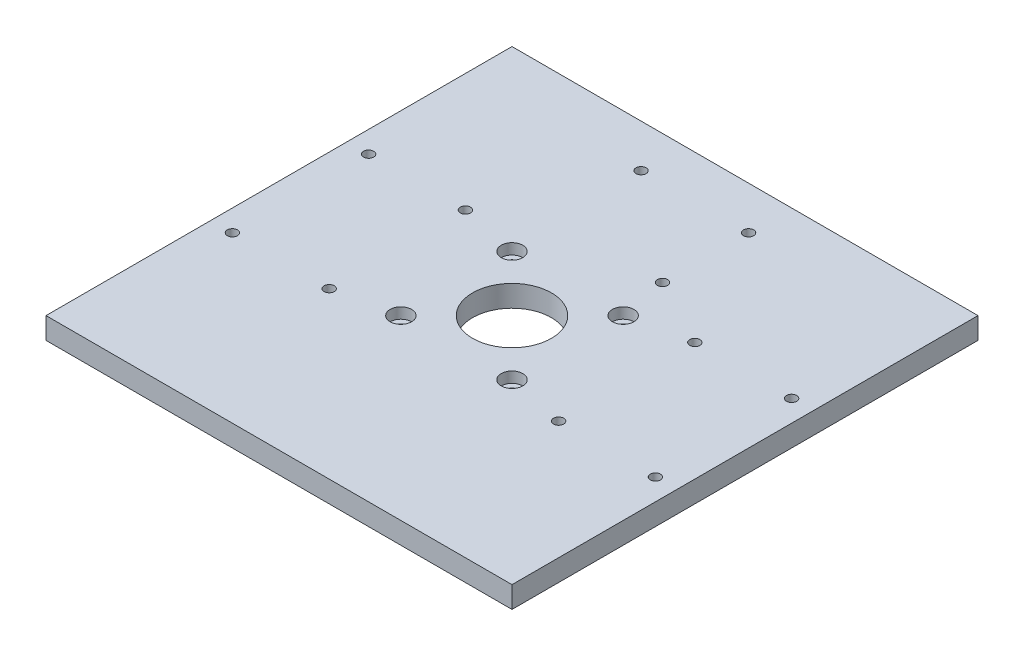
ISO-10303-21;
HEADER;
FILE_DESCRIPTION(('STEP AP214'),'2;1');
FILE_NAME('part.step','',(''),(''),'','','');
FILE_SCHEMA(('AUTOMOTIVE_DESIGN { 1 0 10303 214 1 1 1 1 }'));
ENDSEC;
DATA;
#1=APPLICATION_CONTEXT('core data for automotive mechanical design processes');
#2=APPLICATION_PROTOCOL_DEFINITION('international standard','automotive_design',2000,#1);
#3=PRODUCT_CONTEXT('',#1,'mechanical');
#4=PRODUCT('Part','Part','',(#3));
#5=PRODUCT_RELATED_PRODUCT_CATEGORY('part','',(#4));
#6=PRODUCT_DEFINITION_FORMATION('','',#4);
#7=PRODUCT_DEFINITION_CONTEXT('part definition',#1,'design');
#8=PRODUCT_DEFINITION('design','',#6,#7);
#9=PRODUCT_DEFINITION_SHAPE('','',#8);
#10=(LENGTH_UNIT() NAMED_UNIT(*) SI_UNIT(.MILLI.,.METRE.));
#11=(NAMED_UNIT(*) PLANE_ANGLE_UNIT() SI_UNIT($,.RADIAN.));
#12=(NAMED_UNIT(*) SI_UNIT($,.STERADIAN.) SOLID_ANGLE_UNIT());
#13=UNCERTAINTY_MEASURE_WITH_UNIT(LENGTH_MEASURE(1.E-05),#10,'distance_accuracy_value','');
#14=(GEOMETRIC_REPRESENTATION_CONTEXT(3) GLOBAL_UNCERTAINTY_ASSIGNED_CONTEXT((#13)) GLOBAL_UNIT_ASSIGNED_CONTEXT((#10,
#11,#12)) REPRESENTATION_CONTEXT('',''));
#15=CARTESIAN_POINT('',(0.,0.,0.));
#16=DIRECTION('',(0.,0.,1.));
#17=DIRECTION('',(1.,0.,0.));
#18=AXIS2_PLACEMENT_3D('',#15,#16,#17);
#19=CARTESIAN_POINT('',(-15.4999999999997,0.,15.5));
#20=DIRECTION('',(0.,1.,0.));
#21=DIRECTION('',(0.,0.,1.));
#22=AXIS2_PLACEMENT_3D('',#19,#20,#21);
#23=CYLINDRICAL_SURFACE('',#22,1.42);
#24=CARTESIAN_POINT('',(-15.4999999999997,0.,15.5));
#25=DIRECTION('',(0.,1.,0.));
#26=DIRECTION('',(0.,0.,1.));
#27=AXIS2_PLACEMENT_3D('',#24,#25,#26);
#28=CIRCLE('',#27,1.42);
#29=CARTESIAN_POINT('',(-15.4999999999997,0.,16.92));
#30=VERTEX_POINT('',#29);
#31=EDGE_CURVE('E118',#30,#30,#28,.T.);
#32=ORIENTED_EDGE('',*,*,#31,.F.);
#33=EDGE_LOOP('',(#32));
#34=FACE_BOUND('',#33,.T.);
#35=CARTESIAN_POINT('',(-15.4999999999997,3.,15.5));
#36=DIRECTION('',(0.,1.,0.));
#37=DIRECTION('',(0.,0.,1.));
#38=AXIS2_PLACEMENT_3D('',#35,#36,#37);
#39=CIRCLE('',#38,1.42);
#40=CARTESIAN_POINT('',(-15.4999999999997,3.,16.92));
#41=VERTEX_POINT('',#40);
#42=EDGE_CURVE('E127',#41,#41,#39,.F.);
#43=ORIENTED_EDGE('',*,*,#42,.F.);
#44=EDGE_LOOP('',(#43));
#45=FACE_BOUND('',#44,.T.);
#46=ADVANCED_FACE('F38',(#34,#45),#23,.F.);
#47=CARTESIAN_POINT('',(15.5000000000003,0.,15.5));
#48=DIRECTION('',(0.,1.,0.));
#49=DIRECTION('',(0.,0.,1.));
#50=AXIS2_PLACEMENT_3D('',#47,#48,#49);
#51=CYLINDRICAL_SURFACE('',#50,1.42);
#52=CARTESIAN_POINT('',(15.5000000000003,0.,15.5));
#53=DIRECTION('',(0.,1.,0.));
#54=DIRECTION('',(0.,0.,1.));
#55=AXIS2_PLACEMENT_3D('',#52,#53,#54);
#56=CIRCLE('',#55,1.42);
#57=CARTESIAN_POINT('',(15.5000000000003,0.,16.92));
#58=VERTEX_POINT('',#57);
#59=EDGE_CURVE('E223',#58,#58,#56,.T.);
#60=ORIENTED_EDGE('',*,*,#59,.F.);
#61=EDGE_LOOP('',(#60));
#62=FACE_BOUND('',#61,.T.);
#63=CARTESIAN_POINT('',(15.5000000000003,3.,15.5));
#64=DIRECTION('',(0.,1.,0.));
#65=DIRECTION('',(0.,0.,1.));
#66=AXIS2_PLACEMENT_3D('',#63,#64,#65);
#67=CIRCLE('',#66,1.42);
#68=CARTESIAN_POINT('',(15.5000000000003,3.,16.92));
#69=VERTEX_POINT('',#68);
#70=EDGE_CURVE('E123',#69,#69,#67,.F.);
#71=ORIENTED_EDGE('',*,*,#70,.F.);
#72=EDGE_LOOP('',(#71));
#73=FACE_BOUND('',#72,.T.);
#74=ADVANCED_FACE('F255',(#62,#73),#51,.F.);
#75=CARTESIAN_POINT('',(15.5,0.,-15.5));
#76=DIRECTION('',(0.,1.,0.));
#77=DIRECTION('',(0.,0.,1.));
#78=AXIS2_PLACEMENT_3D('',#75,#76,#77);
#79=CYLINDRICAL_SURFACE('',#78,1.42);
#80=CARTESIAN_POINT('',(15.5,0.,-15.5));
#81=DIRECTION('',(0.,1.,0.));
#82=DIRECTION('',(0.,0.,1.));
#83=AXIS2_PLACEMENT_3D('',#80,#81,#82);
#84=CIRCLE('',#83,1.42);
#85=CARTESIAN_POINT('',(15.5,0.,-14.08));
#86=VERTEX_POINT('',#85);
#87=EDGE_CURVE('E219',#86,#86,#84,.T.);
#88=ORIENTED_EDGE('',*,*,#87,.F.);
#89=EDGE_LOOP('',(#88));
#90=FACE_BOUND('',#89,.T.);
#91=CARTESIAN_POINT('',(15.5,3.,-15.5));
#92=DIRECTION('',(0.,1.,0.));
#93=DIRECTION('',(0.,0.,1.));
#94=AXIS2_PLACEMENT_3D('',#91,#92,#93);
#95=CIRCLE('',#94,1.42);
#96=CARTESIAN_POINT('',(15.5,3.,-14.08));
#97=VERTEX_POINT('',#96);
#98=EDGE_CURVE('E120',#97,#97,#95,.F.);
#99=ORIENTED_EDGE('',*,*,#98,.F.);
#100=EDGE_LOOP('',(#99));
#101=FACE_BOUND('',#100,.T.);
#102=ADVANCED_FACE('F261',(#90,#101),#79,.F.);
#103=CARTESIAN_POINT('',(-15.5,0.,-15.5));
#104=DIRECTION('',(0.,1.,0.));
#105=DIRECTION('',(0.,0.,1.));
#106=AXIS2_PLACEMENT_3D('',#103,#104,#105);
#107=CYLINDRICAL_SURFACE('',#106,1.42);
#108=CARTESIAN_POINT('',(-15.5,0.,-15.5));
#109=DIRECTION('',(0.,1.,0.));
#110=DIRECTION('',(0.,0.,1.));
#111=AXIS2_PLACEMENT_3D('',#108,#109,#110);
#112=CIRCLE('',#111,1.42);
#113=CARTESIAN_POINT('',(-15.5,0.,-14.08));
#114=VERTEX_POINT('',#113);
#115=EDGE_CURVE('E222',#114,#114,#112,.T.);
#116=ORIENTED_EDGE('',*,*,#115,.F.);
#117=EDGE_LOOP('',(#116));
#118=FACE_BOUND('',#117,.T.);
#119=CARTESIAN_POINT('',(-15.5,3.,-15.5));
#120=DIRECTION('',(0.,1.,0.));
#121=DIRECTION('',(0.,0.,1.));
#122=AXIS2_PLACEMENT_3D('',#119,#120,#121);
#123=CIRCLE('',#122,1.42);
#124=CARTESIAN_POINT('',(-15.5,3.,-14.08));
#125=VERTEX_POINT('',#124);
#126=EDGE_CURVE('E115',#125,#125,#123,.F.);
#127=ORIENTED_EDGE('',*,*,#126,.F.);
#128=EDGE_LOOP('',(#127));
#129=FACE_BOUND('',#128,.T.);
#130=ADVANCED_FACE('F267',(#118,#129),#107,.F.);
#131=CARTESIAN_POINT('',(0.,6.,0.));
#132=DIRECTION('',(0.,-1.,0.));
#133=DIRECTION('',(0.,0.,-1.));
#134=AXIS2_PLACEMENT_3D('',#131,#132,#133);
#135=PLANE('',#134);
#136=CARTESIAN_POINT('',(-17.,6.,-53.));
#137=DIRECTION('',(0.,1.,0.));
#138=DIRECTION('',(0.,0.,1.));
#139=AXIS2_PLACEMENT_3D('',#136,#137,#138);
#140=CIRCLE('',#139,1.42);
#141=CARTESIAN_POINT('',(-17.,6.,-51.58));
#142=VERTEX_POINT('',#141);
#143=EDGE_CURVE('E164',#142,#142,#140,.T.);
#144=ORIENTED_EDGE('',*,*,#143,.F.);
#145=EDGE_LOOP('',(#144));
#146=FACE_BOUND('',#145,.T.);
#147=CARTESIAN_POINT('',(13.,6.,-29.));
#148=DIRECTION('',(0.,1.,0.));
#149=DIRECTION('',(0.,0.,1.));
#150=AXIS2_PLACEMENT_3D('',#147,#148,#149);
#151=CIRCLE('',#150,1.42);
#152=CARTESIAN_POINT('',(13.,6.,-27.58));
#153=VERTEX_POINT('',#152);
#154=EDGE_CURVE('E169',#153,#153,#151,.T.);
#155=ORIENTED_EDGE('',*,*,#154,.F.);
#156=EDGE_LOOP('',(#155));
#157=FACE_BOUND('',#156,.T.);
#158=CARTESIAN_POINT('',(13.,6.,-53.));
#159=DIRECTION('',(0.,1.,0.));
#160=DIRECTION('',(0.,0.,1.));
#161=AXIS2_PLACEMENT_3D('',#158,#159,#160);
#162=CIRCLE('',#161,1.42);
#163=CARTESIAN_POINT('',(13.,6.,-51.58));
#164=VERTEX_POINT('',#163);
#165=EDGE_CURVE('E161',#164,#164,#162,.T.);
#166=ORIENTED_EDGE('',*,*,#165,.F.);
#167=EDGE_LOOP('',(#166));
#168=FACE_BOUND('',#167,.T.);
#169=CARTESIAN_POINT('',(-32.0000000000004,6.,-19.));
#170=DIRECTION('',(0.,1.,0.));
#171=DIRECTION('',(0.,0.,1.));
#172=AXIS2_PLACEMENT_3D('',#169,#170,#171);
#173=CIRCLE('',#172,1.42);
#174=CARTESIAN_POINT('',(-32.0000000000004,6.,-17.58));
#175=VERTEX_POINT('',#174);
#176=EDGE_CURVE('E140',#175,#175,#173,.T.);
#177=ORIENTED_EDGE('',*,*,#176,.F.);
#178=EDGE_LOOP('',(#177));
#179=FACE_BOUND('',#178,.T.);
#180=CARTESIAN_POINT('',(-32.,6.,19.));
#181=DIRECTION('',(0.,1.,0.));
#182=DIRECTION('',(0.,0.,1.));
#183=AXIS2_PLACEMENT_3D('',#180,#181,#182);
#184=CIRCLE('',#183,1.42);
#185=CARTESIAN_POINT('',(-32.,6.,20.42));
#186=VERTEX_POINT('',#185);
#187=EDGE_CURVE('E180',#186,#186,#184,.T.);
#188=ORIENTED_EDGE('',*,*,#187,.F.);
#189=EDGE_LOOP('',(#188));
#190=FACE_BOUND('',#189,.T.);
#191=CARTESIAN_POINT('',(-59.,6.,19.));
#192=DIRECTION('',(0.,1.,0.));
#193=DIRECTION('',(0.,0.,1.));
#194=AXIS2_PLACEMENT_3D('',#191,#192,#193);
#195=CIRCLE('',#194,1.42);
#196=CARTESIAN_POINT('',(-59.,6.,20.42));
#197=VERTEX_POINT('',#196);
#198=EDGE_CURVE('E183',#197,#197,#195,.T.);
#199=ORIENTED_EDGE('',*,*,#198,.F.);
#200=EDGE_LOOP('',(#199));
#201=FACE_BOUND('',#200,.T.);
#202=CARTESIAN_POINT('',(59.0000000000004,6.,-19.));
#203=DIRECTION('',(0.,1.,0.));
#204=DIRECTION('',(0.,0.,-1.));
#205=AXIS2_PLACEMENT_3D('',#202,#203,#204);
#206=CIRCLE('',#205,1.42);
#207=CARTESIAN_POINT('',(59.0000000000004,6.,-20.42));
#208=VERTEX_POINT('',#207);
#209=EDGE_CURVE('E186',#208,#208,#206,.T.);
#210=ORIENTED_EDGE('',*,*,#209,.F.);
#211=EDGE_LOOP('',(#210));
#212=FACE_BOUND('',#211,.T.);
#213=CARTESIAN_POINT('',(59.,6.,18.9999999999999));
#214=DIRECTION('',(0.,1.,0.));
#215=DIRECTION('',(0.,0.,-1.));
#216=AXIS2_PLACEMENT_3D('',#213,#214,#215);
#217=CIRCLE('',#216,1.42);
#218=CARTESIAN_POINT('',(59.,6.,17.5799999999999));
#219=VERTEX_POINT('',#218);
#220=EDGE_CURVE('E189',#219,#219,#217,.T.);
#221=ORIENTED_EDGE('',*,*,#220,.F.);
#222=EDGE_LOOP('',(#221));
#223=FACE_BOUND('',#222,.T.);
#224=CARTESIAN_POINT('',(32.,6.,18.9999999999999));
#225=DIRECTION('',(0.,1.,0.));
#226=DIRECTION('',(0.,0.,-1.));
#227=AXIS2_PLACEMENT_3D('',#224,#225,#226);
#228=CIRCLE('',#227,1.42);
#229=CARTESIAN_POINT('',(32.,6.,17.5799999999999));
#230=VERTEX_POINT('',#229);
#231=EDGE_CURVE('E192',#230,#230,#228,.T.);
#232=ORIENTED_EDGE('',*,*,#231,.F.);
#233=EDGE_LOOP('',(#232));
#234=FACE_BOUND('',#233,.T.);
#235=CARTESIAN_POINT('',(32.0000000000004,6.,-19.));
#236=DIRECTION('',(0.,1.,0.));
#237=DIRECTION('',(0.,0.,-1.));
#238=AXIS2_PLACEMENT_3D('',#235,#236,#237);
#239=CIRCLE('',#238,1.42);
#240=CARTESIAN_POINT('',(32.0000000000004,6.,-20.42));
#241=VERTEX_POINT('',#240);
#242=EDGE_CURVE('E160',#241,#241,#239,.T.);
#243=ORIENTED_EDGE('',*,*,#242,.F.);
#244=EDGE_LOOP('',(#243));
#245=FACE_BOUND('',#244,.T.);
#246=CARTESIAN_POINT('',(-59.0000000000004,6.,-19.));
#247=DIRECTION('',(0.,1.,0.));
#248=DIRECTION('',(0.,0.,1.));
#249=AXIS2_PLACEMENT_3D('',#246,#247,#248);
#250=CIRCLE('',#249,1.42);
#251=CARTESIAN_POINT('',(-59.0000000000004,6.,-17.58));
#252=VERTEX_POINT('',#251);
#253=EDGE_CURVE('E135',#252,#252,#250,.T.);
#254=ORIENTED_EDGE('',*,*,#253,.F.);
#255=EDGE_LOOP('',(#254));
#256=FACE_BOUND('',#255,.T.);
#257=CARTESIAN_POINT('',(15.5,6.,-15.5));
#258=DIRECTION('',(0.,1.,0.));
#259=DIRECTION('',(0.,0.,1.));
#260=AXIS2_PLACEMENT_3D('',#257,#258,#259);
#261=CIRCLE('',#260,3.);
#262=CARTESIAN_POINT('',(15.5,6.,-12.5));
#263=VERTEX_POINT('',#262);
#264=EDGE_CURVE('E201',#263,#263,#261,.T.);
#265=ORIENTED_EDGE('',*,*,#264,.F.);
#266=EDGE_LOOP('',(#265));
#267=FACE_BOUND('',#266,.T.);
#268=CARTESIAN_POINT('',(15.5000000000003,6.,15.5));
#269=DIRECTION('',(0.,1.,0.));
#270=DIRECTION('',(0.,0.,1.));
#271=AXIS2_PLACEMENT_3D('',#268,#269,#270);
#272=CIRCLE('',#271,3.);
#273=CARTESIAN_POINT('',(15.5000000000003,6.,18.5));
#274=VERTEX_POINT('',#273);
#275=EDGE_CURVE('E207',#274,#274,#272,.T.);
#276=ORIENTED_EDGE('',*,*,#275,.F.);
#277=EDGE_LOOP('',(#276));
#278=FACE_BOUND('',#277,.T.);
#279=CARTESIAN_POINT('',(-15.4999999999997,6.,15.5));
#280=DIRECTION('',(0.,1.,0.));
#281=DIRECTION('',(0.,0.,1.));
#282=AXIS2_PLACEMENT_3D('',#279,#280,#281);
#283=CIRCLE('',#282,3.);
#284=CARTESIAN_POINT('',(-15.4999999999997,6.,18.5));
#285=VERTEX_POINT('',#284);
#286=EDGE_CURVE('E134',#285,#285,#283,.T.);
#287=ORIENTED_EDGE('',*,*,#286,.F.);
#288=EDGE_LOOP('',(#287));
#289=FACE_BOUND('',#288,.T.);
#290=CARTESIAN_POINT('',(-15.5,6.,-15.5));
#291=DIRECTION('',(0.,1.,0.));
#292=DIRECTION('',(0.,0.,1.));
#293=AXIS2_PLACEMENT_3D('',#290,#291,#292);
#294=CIRCLE('',#293,3.);
#295=CARTESIAN_POINT('',(-15.5,6.,-12.5));
#296=VERTEX_POINT('',#295);
#297=EDGE_CURVE('E130',#296,#296,#294,.T.);
#298=ORIENTED_EDGE('',*,*,#297,.F.);
#299=EDGE_LOOP('',(#298));
#300=FACE_BOUND('',#299,.T.);
#301=DIRECTION('',(0.,0.,-1.));
#302=VECTOR('',#301,1.);
#303=CARTESIAN_POINT('',(65.,6.,65.));
#304=LINE('',#303,#302);
#305=CARTESIAN_POINT('',(65.,6.,65.));
#306=VERTEX_POINT('',#305);
#307=CARTESIAN_POINT('',(65.,6.,-65.));
#308=VERTEX_POINT('',#307);
#309=EDGE_CURVE('E93',#306,#308,#304,.T.);
#310=ORIENTED_EDGE('',*,*,#309,.T.);
#311=DIRECTION('',(-1.,0.,0.));
#312=VECTOR('',#311,1.);
#313=CARTESIAN_POINT('',(-65.,6.,-65.));
#314=LINE('',#313,#312);
#315=CARTESIAN_POINT('',(-65.,6.,-65.));
#316=VERTEX_POINT('',#315);
#317=EDGE_CURVE('E87',#308,#316,#314,.T.);
#318=ORIENTED_EDGE('',*,*,#317,.T.);
#319=DIRECTION('',(0.,0.,1.));
#320=VECTOR('',#319,1.);
#321=CARTESIAN_POINT('',(-65.,6.,65.));
#322=LINE('',#321,#320);
#323=CARTESIAN_POINT('',(-65.,6.,65.));
#324=VERTEX_POINT('',#323);
#325=EDGE_CURVE('E91',#316,#324,#322,.T.);
#326=ORIENTED_EDGE('',*,*,#325,.T.);
#327=DIRECTION('',(1.,0.,0.));
#328=VECTOR('',#327,1.);
#329=CARTESIAN_POINT('',(-65.,6.,65.));
#330=LINE('',#329,#328);
#331=EDGE_CURVE('E57',#324,#306,#330,.T.);
#332=ORIENTED_EDGE('',*,*,#331,.T.);
#333=EDGE_LOOP('',(#310,#318,#326,#332));
#334=FACE_BOUND('',#333,.T.);
#335=CARTESIAN_POINT('',(0.,6.,0.));
#336=DIRECTION('',(0.,1.,0.));
#337=DIRECTION('',(0.,0.,1.));
#338=AXIS2_PLACEMENT_3D('',#335,#336,#337);
#339=CIRCLE('',#338,11.);
#340=CARTESIAN_POINT('',(0.,6.,11.));
#341=VERTEX_POINT('',#340);
#342=EDGE_CURVE('E109',#341,#341,#339,.T.);
#343=ORIENTED_EDGE('',*,*,#342,.F.);
#344=EDGE_LOOP('',(#343));
#345=FACE_BOUND('',#344,.T.);
#346=ADVANCED_FACE('F88',(#146,#157,#168,#179,#190,#201,#212,#223,#234,#245,#256,#267,#278,#289,
#300,#334,#345),#135,.F.);
#347=CARTESIAN_POINT('',(0.,0.,0.));
#348=DIRECTION('',(0.,-1.,0.));
#349=DIRECTION('',(0.,0.,-1.));
#350=AXIS2_PLACEMENT_3D('',#347,#348,#349);
#351=PLANE('',#350);
#352=CARTESIAN_POINT('',(-17.,0.,-53.));
#353=DIRECTION('',(0.,-1.,0.));
#354=DIRECTION('',(0.,0.,-1.));
#355=AXIS2_PLACEMENT_3D('',#352,#353,#354);
#356=CIRCLE('',#355,1.42);
#357=CARTESIAN_POINT('',(-17.,0.,-54.42));
#358=VERTEX_POINT('',#357);
#359=EDGE_CURVE('E42',#358,#358,#356,.T.);
#360=ORIENTED_EDGE('',*,*,#359,.F.);
#361=EDGE_LOOP('',(#360));
#362=FACE_BOUND('',#361,.T.);
#363=CARTESIAN_POINT('',(13.,0.,-29.));
#364=DIRECTION('',(0.,-1.,0.));
#365=DIRECTION('',(0.,0.,-1.));
#366=AXIS2_PLACEMENT_3D('',#363,#364,#365);
#367=CIRCLE('',#366,1.42);
#368=CARTESIAN_POINT('',(13.,0.,-30.42));
#369=VERTEX_POINT('',#368);
#370=EDGE_CURVE('E162',#369,#369,#367,.T.);
#371=ORIENTED_EDGE('',*,*,#370,.F.);
#372=EDGE_LOOP('',(#371));
#373=FACE_BOUND('',#372,.T.);
#374=CARTESIAN_POINT('',(13.,0.,-53.));
#375=DIRECTION('',(0.,-1.,0.));
#376=DIRECTION('',(0.,0.,-1.));
#377=AXIS2_PLACEMENT_3D('',#374,#375,#376);
#378=CIRCLE('',#377,1.42);
#379=CARTESIAN_POINT('',(13.,0.,-54.42));
#380=VERTEX_POINT('',#379);
#381=EDGE_CURVE('E158',#380,#380,#378,.T.);
#382=ORIENTED_EDGE('',*,*,#381,.F.);
#383=EDGE_LOOP('',(#382));
#384=FACE_BOUND('',#383,.T.);
#385=CARTESIAN_POINT('',(-32.0000000000004,0.,-19.));
#386=DIRECTION('',(0.,-1.,0.));
#387=DIRECTION('',(0.,0.,-1.));
#388=AXIS2_PLACEMENT_3D('',#385,#386,#387);
#389=CIRCLE('',#388,1.42);
#390=CARTESIAN_POINT('',(-32.0000000000004,0.,-20.42));
#391=VERTEX_POINT('',#390);
#392=EDGE_CURVE('E155',#391,#391,#389,.T.);
#393=ORIENTED_EDGE('',*,*,#392,.F.);
#394=EDGE_LOOP('',(#393));
#395=FACE_BOUND('',#394,.T.);
#396=CARTESIAN_POINT('',(-32.,0.,19.));
#397=DIRECTION('',(0.,-1.,0.));
#398=DIRECTION('',(0.,0.,-1.));
#399=AXIS2_PLACEMENT_3D('',#396,#397,#398);
#400=CIRCLE('',#399,1.42);
#401=CARTESIAN_POINT('',(-32.,0.,17.58));
#402=VERTEX_POINT('',#401);
#403=EDGE_CURVE('E152',#402,#402,#400,.T.);
#404=ORIENTED_EDGE('',*,*,#403,.F.);
#405=EDGE_LOOP('',(#404));
#406=FACE_BOUND('',#405,.T.);
#407=CARTESIAN_POINT('',(-59.,0.,19.));
#408=DIRECTION('',(0.,-1.,0.));
#409=DIRECTION('',(0.,0.,-1.));
#410=AXIS2_PLACEMENT_3D('',#407,#408,#409);
#411=CIRCLE('',#410,1.42);
#412=CARTESIAN_POINT('',(-59.,0.,17.58));
#413=VERTEX_POINT('',#412);
#414=EDGE_CURVE('E149',#413,#413,#411,.T.);
#415=ORIENTED_EDGE('',*,*,#414,.F.);
#416=EDGE_LOOP('',(#415));
#417=FACE_BOUND('',#416,.T.);
#418=CARTESIAN_POINT('',(59.0000000000004,0.,-19.));
#419=DIRECTION('',(0.,-1.,0.));
#420=DIRECTION('',(0.,0.,-1.));
#421=AXIS2_PLACEMENT_3D('',#418,#419,#420);
#422=CIRCLE('',#421,1.42);
#423=CARTESIAN_POINT('',(59.0000000000004,0.,-20.42));
#424=VERTEX_POINT('',#423);
#425=EDGE_CURVE('E146',#424,#424,#422,.T.);
#426=ORIENTED_EDGE('',*,*,#425,.F.);
#427=EDGE_LOOP('',(#426));
#428=FACE_BOUND('',#427,.T.);
#429=CARTESIAN_POINT('',(59.,0.,18.9999999999999));
#430=DIRECTION('',(0.,-1.,0.));
#431=DIRECTION('',(0.,0.,-1.));
#432=AXIS2_PLACEMENT_3D('',#429,#430,#431);
#433=CIRCLE('',#432,1.42);
#434=CARTESIAN_POINT('',(59.,0.,17.5799999999999));
#435=VERTEX_POINT('',#434);
#436=EDGE_CURVE('E143',#435,#435,#433,.T.);
#437=ORIENTED_EDGE('',*,*,#436,.F.);
#438=EDGE_LOOP('',(#437));
#439=FACE_BOUND('',#438,.T.);
#440=CARTESIAN_POINT('',(32.,0.,18.9999999999999));
#441=DIRECTION('',(0.,-1.,0.));
#442=DIRECTION('',(0.,0.,-1.));
#443=AXIS2_PLACEMENT_3D('',#440,#441,#442);
#444=CIRCLE('',#443,1.42);
#445=CARTESIAN_POINT('',(32.,0.,17.5799999999999));
#446=VERTEX_POINT('',#445);
#447=EDGE_CURVE('E139',#446,#446,#444,.T.);
#448=ORIENTED_EDGE('',*,*,#447,.F.);
#449=EDGE_LOOP('',(#448));
#450=FACE_BOUND('',#449,.T.);
#451=CARTESIAN_POINT('',(32.0000000000004,0.,-19.));
#452=DIRECTION('',(0.,-1.,0.));
#453=DIRECTION('',(0.,0.,-1.));
#454=AXIS2_PLACEMENT_3D('',#451,#452,#453);
#455=CIRCLE('',#454,1.42);
#456=CARTESIAN_POINT('',(32.0000000000004,0.,-20.42));
#457=VERTEX_POINT('',#456);
#458=EDGE_CURVE('E136',#457,#457,#455,.T.);
#459=ORIENTED_EDGE('',*,*,#458,.F.);
#460=EDGE_LOOP('',(#459));
#461=FACE_BOUND('',#460,.T.);
#462=CARTESIAN_POINT('',(-59.0000000000004,0.,-19.));
#463=DIRECTION('',(0.,-1.,0.));
#464=DIRECTION('',(0.,0.,-1.));
#465=AXIS2_PLACEMENT_3D('',#462,#463,#464);
#466=CIRCLE('',#465,1.42);
#467=CARTESIAN_POINT('',(-59.0000000000004,0.,-20.42));
#468=VERTEX_POINT('',#467);
#469=EDGE_CURVE('E131',#468,#468,#466,.T.);
#470=ORIENTED_EDGE('',*,*,#469,.F.);
#471=EDGE_LOOP('',(#470));
#472=FACE_BOUND('',#471,.T.);
#473=ORIENTED_EDGE('',*,*,#87,.T.);
#474=EDGE_LOOP('',(#473));
#475=FACE_BOUND('',#474,.T.);
#476=ORIENTED_EDGE('',*,*,#59,.T.);
#477=EDGE_LOOP('',(#476));
#478=FACE_BOUND('',#477,.T.);
#479=ORIENTED_EDGE('',*,*,#31,.T.);
#480=EDGE_LOOP('',(#479));
#481=FACE_BOUND('',#480,.T.);
#482=ORIENTED_EDGE('',*,*,#115,.T.);
#483=EDGE_LOOP('',(#482));
#484=FACE_BOUND('',#483,.T.);
#485=DIRECTION('',(0.,0.,-1.));
#486=VECTOR('',#485,1.);
#487=CARTESIAN_POINT('',(65.,0.,65.));
#488=LINE('',#487,#486);
#489=CARTESIAN_POINT('',(65.,0.,65.));
#490=VERTEX_POINT('',#489);
#491=CARTESIAN_POINT('',(65.,0.,-65.));
#492=VERTEX_POINT('',#491);
#493=EDGE_CURVE('E106',#490,#492,#488,.T.);
#494=ORIENTED_EDGE('',*,*,#493,.F.);
#495=DIRECTION('',(1.,0.,0.));
#496=VECTOR('',#495,1.);
#497=CARTESIAN_POINT('',(-65.,0.,65.));
#498=LINE('',#497,#496);
#499=CARTESIAN_POINT('',(-65.,0.,65.));
#500=VERTEX_POINT('',#499);
#501=EDGE_CURVE('E80',#500,#490,#498,.T.);
#502=ORIENTED_EDGE('',*,*,#501,.F.);
#503=DIRECTION('',(0.,0.,1.));
#504=VECTOR('',#503,1.);
#505=CARTESIAN_POINT('',(-65.,0.,65.));
#506=LINE('',#505,#504);
#507=CARTESIAN_POINT('',(-65.,0.,-65.));
#508=VERTEX_POINT('',#507);
#509=EDGE_CURVE('E74',#508,#500,#506,.T.);
#510=ORIENTED_EDGE('',*,*,#509,.F.);
#511=DIRECTION('',(-1.,0.,0.));
#512=VECTOR('',#511,1.);
#513=CARTESIAN_POINT('',(-65.,0.,-65.));
#514=LINE('',#513,#512);
#515=EDGE_CURVE('E97',#492,#508,#514,.T.);
#516=ORIENTED_EDGE('',*,*,#515,.F.);
#517=EDGE_LOOP('',(#494,#502,#510,#516));
#518=FACE_BOUND('',#517,.T.);
#519=CARTESIAN_POINT('',(0.,0.,0.));
#520=DIRECTION('',(0.,1.,0.));
#521=DIRECTION('',(0.,0.,1.));
#522=AXIS2_PLACEMENT_3D('',#519,#520,#521);
#523=CIRCLE('',#522,11.);
#524=CARTESIAN_POINT('',(0.,0.,11.));
#525=VERTEX_POINT('',#524);
#526=EDGE_CURVE('E230',#525,#525,#523,.T.);
#527=ORIENTED_EDGE('',*,*,#526,.T.);
#528=EDGE_LOOP('',(#527));
#529=FACE_BOUND('',#528,.T.);
#530=ADVANCED_FACE('F236',(#362,#373,#384,#395,#406,#417,#428,#439,#450,#461,#472,#475,#478,
#481,#484,#518,#529),#351,.T.);
#531=CARTESIAN_POINT('',(65.,6.,65.));
#532=DIRECTION('',(-1.,0.,0.));
#533=DIRECTION('',(0.,0.,1.));
#534=AXIS2_PLACEMENT_3D('',#531,#532,#533);
#535=PLANE('',#534);
#536=ORIENTED_EDGE('',*,*,#493,.T.);
#537=DIRECTION('',(0.,-1.,0.));
#538=VECTOR('',#537,1.);
#539=CARTESIAN_POINT('',(65.,6.,-65.));
#540=LINE('',#539,#538);
#541=EDGE_CURVE('E11',#308,#492,#540,.T.);
#542=ORIENTED_EDGE('',*,*,#541,.F.);
#543=ORIENTED_EDGE('',*,*,#309,.F.);
#544=DIRECTION('',(0.,-1.,0.));
#545=VECTOR('',#544,1.);
#546=CARTESIAN_POINT('',(65.,6.,65.));
#547=LINE('',#546,#545);
#548=EDGE_CURVE('E102',#306,#490,#547,.T.);
#549=ORIENTED_EDGE('',*,*,#548,.T.);
#550=EDGE_LOOP('',(#536,#542,#543,#549));
#551=FACE_BOUND('',#550,.T.);
#552=ADVANCED_FACE('F40',(#551),#535,.F.);
#553=CARTESIAN_POINT('',(-65.,6.,-65.));
#554=DIRECTION('',(0.,0.,1.));
#555=DIRECTION('',(1.,0.,0.));
#556=AXIS2_PLACEMENT_3D('',#553,#554,#555);
#557=PLANE('',#556);
#558=ORIENTED_EDGE('',*,*,#515,.T.);
#559=DIRECTION('',(0.,-1.,0.));
#560=VECTOR('',#559,1.);
#561=CARTESIAN_POINT('',(-65.,6.,-65.));
#562=LINE('',#561,#560);
#563=EDGE_CURVE('E48',#316,#508,#562,.T.);
#564=ORIENTED_EDGE('',*,*,#563,.F.);
#565=ORIENTED_EDGE('',*,*,#317,.F.);
#566=ORIENTED_EDGE('',*,*,#541,.T.);
#567=EDGE_LOOP('',(#558,#564,#565,#566));
#568=FACE_BOUND('',#567,.T.);
#569=ADVANCED_FACE('F96',(#568),#557,.F.);
#570=CARTESIAN_POINT('',(-65.,6.,65.));
#571=DIRECTION('',(1.,0.,0.));
#572=DIRECTION('',(0.,0.,-1.));
#573=AXIS2_PLACEMENT_3D('',#570,#571,#572);
#574=PLANE('',#573);
#575=ORIENTED_EDGE('',*,*,#509,.T.);
#576=DIRECTION('',(0.,-1.,0.));
#577=VECTOR('',#576,1.);
#578=CARTESIAN_POINT('',(-65.,6.,65.));
#579=LINE('',#578,#577);
#580=EDGE_CURVE('E98',#324,#500,#579,.T.);
#581=ORIENTED_EDGE('',*,*,#580,.F.);
#582=ORIENTED_EDGE('',*,*,#325,.F.);
#583=ORIENTED_EDGE('',*,*,#563,.T.);
#584=EDGE_LOOP('',(#575,#581,#582,#583));
#585=FACE_BOUND('',#584,.T.);
#586=ADVANCED_FACE('F100',(#585),#574,.F.);
#587=CARTESIAN_POINT('',(-65.,6.,65.));
#588=DIRECTION('',(0.,0.,-1.));
#589=DIRECTION('',(-1.,0.,0.));
#590=AXIS2_PLACEMENT_3D('',#587,#588,#589);
#591=PLANE('',#590);
#592=ORIENTED_EDGE('',*,*,#501,.T.);
#593=ORIENTED_EDGE('',*,*,#548,.F.);
#594=ORIENTED_EDGE('',*,*,#331,.F.);
#595=ORIENTED_EDGE('',*,*,#580,.T.);
#596=EDGE_LOOP('',(#592,#593,#594,#595));
#597=FACE_BOUND('',#596,.T.);
#598=ADVANCED_FACE('F241',(#597),#591,.F.);
#599=CARTESIAN_POINT('',(0.,6.,0.));
#600=DIRECTION('',(0.,-1.,0.));
#601=DIRECTION('',(0.,0.,-1.));
#602=AXIS2_PLACEMENT_3D('',#599,#600,#601);
#603=CYLINDRICAL_SURFACE('',#602,11.);
#604=ORIENTED_EDGE('',*,*,#342,.T.);
#605=EDGE_LOOP('',(#604));
#606=FACE_BOUND('',#605,.T.);
#607=ORIENTED_EDGE('',*,*,#526,.F.);
#608=EDGE_LOOP('',(#607));
#609=FACE_BOUND('',#608,.T.);
#610=ADVANCED_FACE('F238',(#606,#609),#603,.F.);
#611=CARTESIAN_POINT('',(-15.5,3.,-15.5));
#612=DIRECTION('',(0.,1.,0.));
#613=DIRECTION('',(0.,0.,1.));
#614=AXIS2_PLACEMENT_3D('',#611,#612,#613);
#615=PLANE('',#614);
#616=CARTESIAN_POINT('',(-15.5,3.,-15.5));
#617=DIRECTION('',(0.,1.,0.));
#618=DIRECTION('',(0.,0.,1.));
#619=AXIS2_PLACEMENT_3D('',#616,#617,#618);
#620=CIRCLE('',#619,3.);
#621=CARTESIAN_POINT('',(-15.5,3.,-12.5));
#622=VERTEX_POINT('',#621);
#623=EDGE_CURVE('E119',#622,#622,#620,.T.);
#624=ORIENTED_EDGE('',*,*,#623,.T.);
#625=EDGE_LOOP('',(#624));
#626=FACE_BOUND('',#625,.T.);
#627=ORIENTED_EDGE('',*,*,#126,.T.);
#628=EDGE_LOOP('',(#627));
#629=FACE_BOUND('',#628,.T.);
#630=ADVANCED_FACE('F240',(#626,#629),#615,.T.);
#631=CARTESIAN_POINT('',(-15.5,3.,-15.5));
#632=DIRECTION('',(0.,1.,0.));
#633=DIRECTION('',(0.,0.,1.));
#634=AXIS2_PLACEMENT_3D('',#631,#632,#633);
#635=CYLINDRICAL_SURFACE('',#634,3.);
#636=ORIENTED_EDGE('',*,*,#623,.F.);
#637=EDGE_LOOP('',(#636));
#638=FACE_BOUND('',#637,.T.);
#639=ORIENTED_EDGE('',*,*,#297,.T.);
#640=EDGE_LOOP('',(#639));
#641=FACE_BOUND('',#640,.T.);
#642=ADVANCED_FACE('F248',(#638,#641),#635,.F.);
#643=CARTESIAN_POINT('',(15.5,3.,-15.5));
#644=DIRECTION('',(0.,1.,0.));
#645=DIRECTION('',(0.,0.,1.));
#646=AXIS2_PLACEMENT_3D('',#643,#644,#645);
#647=PLANE('',#646);
#648=CARTESIAN_POINT('',(15.5,3.,-15.5));
#649=DIRECTION('',(0.,1.,0.));
#650=DIRECTION('',(0.,0.,1.));
#651=AXIS2_PLACEMENT_3D('',#648,#649,#650);
#652=CIRCLE('',#651,3.);
#653=CARTESIAN_POINT('',(15.5,3.,-12.5));
#654=VERTEX_POINT('',#653);
#655=EDGE_CURVE('E124',#654,#654,#652,.T.);
#656=ORIENTED_EDGE('',*,*,#655,.T.);
#657=EDGE_LOOP('',(#656));
#658=FACE_BOUND('',#657,.T.);
#659=ORIENTED_EDGE('',*,*,#98,.T.);
#660=EDGE_LOOP('',(#659));
#661=FACE_BOUND('',#660,.T.);
#662=ADVANCED_FACE('F340',(#658,#661),#647,.T.);
#663=CARTESIAN_POINT('',(15.5,3.,-15.5));
#664=DIRECTION('',(0.,1.,0.));
#665=DIRECTION('',(0.,0.,1.));
#666=AXIS2_PLACEMENT_3D('',#663,#664,#665);
#667=CYLINDRICAL_SURFACE('',#666,3.);
#668=ORIENTED_EDGE('',*,*,#655,.F.);
#669=EDGE_LOOP('',(#668));
#670=FACE_BOUND('',#669,.T.);
#671=ORIENTED_EDGE('',*,*,#264,.T.);
#672=EDGE_LOOP('',(#671));
#673=FACE_BOUND('',#672,.T.);
#674=ADVANCED_FACE('F350',(#670,#673),#667,.F.);
#675=CARTESIAN_POINT('',(15.5000000000003,3.,15.5));
#676=DIRECTION('',(0.,1.,0.));
#677=DIRECTION('',(0.,0.,1.));
#678=AXIS2_PLACEMENT_3D('',#675,#676,#677);
#679=PLANE('',#678);
#680=CARTESIAN_POINT('',(15.5000000000003,3.,15.5));
#681=DIRECTION('',(0.,1.,0.));
#682=DIRECTION('',(0.,0.,1.));
#683=AXIS2_PLACEMENT_3D('',#680,#681,#682);
#684=CIRCLE('',#683,3.);
#685=CARTESIAN_POINT('',(15.5000000000003,3.,18.5));
#686=VERTEX_POINT('',#685);
#687=EDGE_CURVE('E204',#686,#686,#684,.T.);
#688=ORIENTED_EDGE('',*,*,#687,.T.);
#689=EDGE_LOOP('',(#688));
#690=FACE_BOUND('',#689,.T.);
#691=ORIENTED_EDGE('',*,*,#70,.T.);
#692=EDGE_LOOP('',(#691));
#693=FACE_BOUND('',#692,.T.);
#694=ADVANCED_FACE('F360',(#690,#693),#679,.T.);
#695=CARTESIAN_POINT('',(15.5000000000003,3.,15.5));
#696=DIRECTION('',(0.,1.,0.));
#697=DIRECTION('',(0.,0.,1.));
#698=AXIS2_PLACEMENT_3D('',#695,#696,#697);
#699=CYLINDRICAL_SURFACE('',#698,3.);
#700=ORIENTED_EDGE('',*,*,#687,.F.);
#701=EDGE_LOOP('',(#700));
#702=FACE_BOUND('',#701,.T.);
#703=ORIENTED_EDGE('',*,*,#275,.T.);
#704=EDGE_LOOP('',(#703));
#705=FACE_BOUND('',#704,.T.);
#706=ADVANCED_FACE('F370',(#702,#705),#699,.F.);
#707=CARTESIAN_POINT('',(-15.4999999999997,3.,15.5));
#708=DIRECTION('',(0.,1.,0.));
#709=DIRECTION('',(0.,0.,1.));
#710=AXIS2_PLACEMENT_3D('',#707,#708,#709);
#711=PLANE('',#710);
#712=CARTESIAN_POINT('',(-15.4999999999997,3.,15.5));
#713=DIRECTION('',(0.,1.,0.));
#714=DIRECTION('',(0.,0.,1.));
#715=AXIS2_PLACEMENT_3D('',#712,#713,#714);
#716=CIRCLE('',#715,3.);
#717=CARTESIAN_POINT('',(-15.4999999999997,3.,18.5));
#718=VERTEX_POINT('',#717);
#719=EDGE_CURVE('E210',#718,#718,#716,.T.);
#720=ORIENTED_EDGE('',*,*,#719,.T.);
#721=EDGE_LOOP('',(#720));
#722=FACE_BOUND('',#721,.T.);
#723=ORIENTED_EDGE('',*,*,#42,.T.);
#724=EDGE_LOOP('',(#723));
#725=FACE_BOUND('',#724,.T.);
#726=ADVANCED_FACE('F380',(#722,#725),#711,.T.);
#727=CARTESIAN_POINT('',(-15.4999999999997,3.,15.5));
#728=DIRECTION('',(0.,1.,0.));
#729=DIRECTION('',(0.,0.,1.));
#730=AXIS2_PLACEMENT_3D('',#727,#728,#729);
#731=CYLINDRICAL_SURFACE('',#730,3.);
#732=ORIENTED_EDGE('',*,*,#719,.F.);
#733=EDGE_LOOP('',(#732));
#734=FACE_BOUND('',#733,.T.);
#735=ORIENTED_EDGE('',*,*,#286,.T.);
#736=EDGE_LOOP('',(#735));
#737=FACE_BOUND('',#736,.T.);
#738=ADVANCED_FACE('F390',(#734,#737),#731,.F.);
#739=CARTESIAN_POINT('',(-59.0000000000004,-4.,-19.));
#740=DIRECTION('',(0.,1.,0.));
#741=DIRECTION('',(0.,0.,1.));
#742=AXIS2_PLACEMENT_3D('',#739,#740,#741);
#743=CYLINDRICAL_SURFACE('',#742,1.42);
#744=ORIENTED_EDGE('',*,*,#469,.T.);
#745=EDGE_LOOP('',(#744));
#746=FACE_BOUND('',#745,.T.);
#747=ORIENTED_EDGE('',*,*,#253,.T.);
#748=EDGE_LOOP('',(#747));
#749=FACE_BOUND('',#748,.T.);
#750=ADVANCED_FACE('F400',(#746,#749),#743,.F.);
#751=CARTESIAN_POINT('',(32.0000000000004,-4.,-19.));
#752=DIRECTION('',(0.,1.,0.));
#753=DIRECTION('',(0.,0.,1.));
#754=AXIS2_PLACEMENT_3D('',#751,#752,#753);
#755=CYLINDRICAL_SURFACE('',#754,1.42);
#756=ORIENTED_EDGE('',*,*,#458,.T.);
#757=EDGE_LOOP('',(#756));
#758=FACE_BOUND('',#757,.T.);
#759=ORIENTED_EDGE('',*,*,#242,.T.);
#760=EDGE_LOOP('',(#759));
#761=FACE_BOUND('',#760,.T.);
#762=ADVANCED_FACE('F410',(#758,#761),#755,.F.);
#763=CARTESIAN_POINT('',(32.,-4.,18.9999999999999));
#764=DIRECTION('',(0.,1.,0.));
#765=DIRECTION('',(0.,0.,1.));
#766=AXIS2_PLACEMENT_3D('',#763,#764,#765);
#767=CYLINDRICAL_SURFACE('',#766,1.42);
#768=ORIENTED_EDGE('',*,*,#447,.T.);
#769=EDGE_LOOP('',(#768));
#770=FACE_BOUND('',#769,.T.);
#771=ORIENTED_EDGE('',*,*,#231,.T.);
#772=EDGE_LOOP('',(#771));
#773=FACE_BOUND('',#772,.T.);
#774=ADVANCED_FACE('F420',(#770,#773),#767,.F.);
#775=CARTESIAN_POINT('',(59.,-4.,18.9999999999999));
#776=DIRECTION('',(0.,1.,0.));
#777=DIRECTION('',(0.,0.,1.));
#778=AXIS2_PLACEMENT_3D('',#775,#776,#777);
#779=CYLINDRICAL_SURFACE('',#778,1.42);
#780=ORIENTED_EDGE('',*,*,#436,.T.);
#781=EDGE_LOOP('',(#780));
#782=FACE_BOUND('',#781,.T.);
#783=ORIENTED_EDGE('',*,*,#220,.T.);
#784=EDGE_LOOP('',(#783));
#785=FACE_BOUND('',#784,.T.);
#786=ADVANCED_FACE('F430',(#782,#785),#779,.F.);
#787=CARTESIAN_POINT('',(59.0000000000004,-4.,-19.));
#788=DIRECTION('',(0.,1.,0.));
#789=DIRECTION('',(0.,0.,1.));
#790=AXIS2_PLACEMENT_3D('',#787,#788,#789);
#791=CYLINDRICAL_SURFACE('',#790,1.42);
#792=ORIENTED_EDGE('',*,*,#425,.T.);
#793=EDGE_LOOP('',(#792));
#794=FACE_BOUND('',#793,.T.);
#795=ORIENTED_EDGE('',*,*,#209,.T.);
#796=EDGE_LOOP('',(#795));
#797=FACE_BOUND('',#796,.T.);
#798=ADVANCED_FACE('F440',(#794,#797),#791,.F.);
#799=CARTESIAN_POINT('',(-59.,-4.,19.));
#800=DIRECTION('',(0.,1.,0.));
#801=DIRECTION('',(0.,0.,1.));
#802=AXIS2_PLACEMENT_3D('',#799,#800,#801);
#803=CYLINDRICAL_SURFACE('',#802,1.42);
#804=ORIENTED_EDGE('',*,*,#414,.T.);
#805=EDGE_LOOP('',(#804));
#806=FACE_BOUND('',#805,.T.);
#807=ORIENTED_EDGE('',*,*,#198,.T.);
#808=EDGE_LOOP('',(#807));
#809=FACE_BOUND('',#808,.T.);
#810=ADVANCED_FACE('F450',(#806,#809),#803,.F.);
#811=CARTESIAN_POINT('',(-32.,-4.,19.));
#812=DIRECTION('',(0.,1.,0.));
#813=DIRECTION('',(0.,0.,1.));
#814=AXIS2_PLACEMENT_3D('',#811,#812,#813);
#815=CYLINDRICAL_SURFACE('',#814,1.42);
#816=ORIENTED_EDGE('',*,*,#403,.T.);
#817=EDGE_LOOP('',(#816));
#818=FACE_BOUND('',#817,.T.);
#819=ORIENTED_EDGE('',*,*,#187,.T.);
#820=EDGE_LOOP('',(#819));
#821=FACE_BOUND('',#820,.T.);
#822=ADVANCED_FACE('F460',(#818,#821),#815,.F.);
#823=CARTESIAN_POINT('',(-32.0000000000004,-4.,-19.));
#824=DIRECTION('',(0.,1.,0.));
#825=DIRECTION('',(0.,0.,1.));
#826=AXIS2_PLACEMENT_3D('',#823,#824,#825);
#827=CYLINDRICAL_SURFACE('',#826,1.42);
#828=ORIENTED_EDGE('',*,*,#392,.T.);
#829=EDGE_LOOP('',(#828));
#830=FACE_BOUND('',#829,.T.);
#831=ORIENTED_EDGE('',*,*,#176,.T.);
#832=EDGE_LOOP('',(#831));
#833=FACE_BOUND('',#832,.T.);
#834=ADVANCED_FACE('F470',(#830,#833),#827,.F.);
#835=CARTESIAN_POINT('',(13.,-4.,-53.));
#836=DIRECTION('',(0.,1.,0.));
#837=DIRECTION('',(0.,0.,1.));
#838=AXIS2_PLACEMENT_3D('',#835,#836,#837);
#839=CYLINDRICAL_SURFACE('',#838,1.42);
#840=ORIENTED_EDGE('',*,*,#381,.T.);
#841=EDGE_LOOP('',(#840));
#842=FACE_BOUND('',#841,.T.);
#843=ORIENTED_EDGE('',*,*,#165,.T.);
#844=EDGE_LOOP('',(#843));
#845=FACE_BOUND('',#844,.T.);
#846=ADVANCED_FACE('F480',(#842,#845),#839,.F.);
#847=CARTESIAN_POINT('',(13.,-4.,-29.));
#848=DIRECTION('',(0.,1.,0.));
#849=DIRECTION('',(0.,0.,1.));
#850=AXIS2_PLACEMENT_3D('',#847,#848,#849);
#851=CYLINDRICAL_SURFACE('',#850,1.42);
#852=ORIENTED_EDGE('',*,*,#370,.T.);
#853=EDGE_LOOP('',(#852));
#854=FACE_BOUND('',#853,.T.);
#855=ORIENTED_EDGE('',*,*,#154,.T.);
#856=EDGE_LOOP('',(#855));
#857=FACE_BOUND('',#856,.T.);
#858=ADVANCED_FACE('F503',(#854,#857),#851,.F.);
#859=CARTESIAN_POINT('',(-17.,-4.,-53.));
#860=DIRECTION('',(0.,1.,0.));
#861=DIRECTION('',(0.,0.,1.));
#862=AXIS2_PLACEMENT_3D('',#859,#860,#861);
#863=CYLINDRICAL_SURFACE('',#862,1.42);
#864=ORIENTED_EDGE('',*,*,#359,.T.);
#865=EDGE_LOOP('',(#864));
#866=FACE_BOUND('',#865,.T.);
#867=ORIENTED_EDGE('',*,*,#143,.T.);
#868=EDGE_LOOP('',(#867));
#869=FACE_BOUND('',#868,.T.);
#870=ADVANCED_FACE('F513',(#866,#869),#863,.F.);
#871=CLOSED_SHELL('',(#46,#74,#102,#130,#346,#530,#552,#569,#586,#598,#610,#630,#642,#662,#674,
#694,#706,#726,#738,#750,#762,#774,#786,#798,#810,#822,#834,#846,#858,#870));
#872=MANIFOLD_SOLID_BREP('B2',#871);
#873=ADVANCED_BREP_SHAPE_REPRESENTATION('',(#18,#872),#14);
#874=SHAPE_DEFINITION_REPRESENTATION(#9,#873);
ENDSEC;
END-ISO-10303-21;
